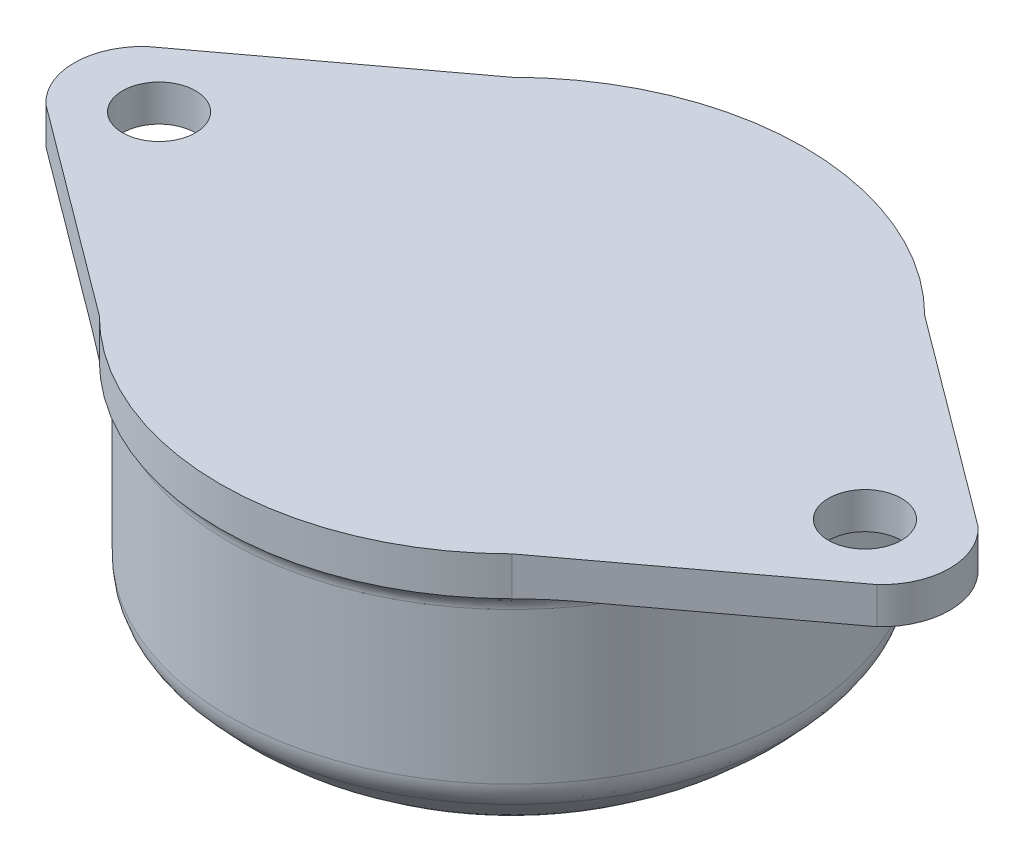
ISO-10303-21;
HEADER;
FILE_DESCRIPTION(('STEP AP214'),'2;1');
FILE_NAME('part.step','',(''),(''),'','','');
FILE_SCHEMA(('AUTOMOTIVE_DESIGN { 1 0 10303 214 1 1 1 1 }'));
ENDSEC;
DATA;
#1=APPLICATION_CONTEXT('core data for automotive mechanical design processes');
#2=APPLICATION_PROTOCOL_DEFINITION('international standard','automotive_design',2000,#1);
#3=PRODUCT_CONTEXT('',#1,'mechanical');
#4=PRODUCT('Part','Part','',(#3));
#5=PRODUCT_RELATED_PRODUCT_CATEGORY('part','',(#4));
#6=PRODUCT_DEFINITION_FORMATION('','',#4);
#7=PRODUCT_DEFINITION_CONTEXT('part definition',#1,'design');
#8=PRODUCT_DEFINITION('design','',#6,#7);
#9=PRODUCT_DEFINITION_SHAPE('','',#8);
#10=(LENGTH_UNIT() NAMED_UNIT(*) SI_UNIT(.MILLI.,.METRE.));
#11=(NAMED_UNIT(*) PLANE_ANGLE_UNIT() SI_UNIT($,.RADIAN.));
#12=(NAMED_UNIT(*) SI_UNIT($,.STERADIAN.) SOLID_ANGLE_UNIT());
#13=UNCERTAINTY_MEASURE_WITH_UNIT(LENGTH_MEASURE(1.E-05),#10,'distance_accuracy_value','');
#14=(GEOMETRIC_REPRESENTATION_CONTEXT(3) GLOBAL_UNCERTAINTY_ASSIGNED_CONTEXT((#13)) GLOBAL_UNIT_ASSIGNED_CONTEXT((#10,
#11,#12)) REPRESENTATION_CONTEXT('',''));
#15=CARTESIAN_POINT('',(0.,0.,0.));
#16=DIRECTION('',(0.,0.,1.));
#17=DIRECTION('',(1.,0.,0.));
#18=AXIS2_PLACEMENT_3D('',#15,#16,#17);
#19=CARTESIAN_POINT('',(0.,0.,0.));
#20=DIRECTION('',(0.,1.,0.));
#21=DIRECTION('',(0.,0.,1.));
#22=AXIS2_PLACEMENT_3D('',#19,#20,#21);
#23=PLANE('',#22);
#24=CARTESIAN_POINT('',(19.35,0.,0.));
#25=DIRECTION('',(0.,1.,0.));
#26=DIRECTION('',(0.,0.,1.));
#27=AXIS2_PLACEMENT_3D('',#24,#25,#26);
#28=CIRCLE('',#27,2.00000000000001);
#29=CARTESIAN_POINT('',(19.35,0.,2.00000000000004));
#30=VERTEX_POINT('',#29);
#31=EDGE_CURVE('E290',#30,#30,#28,.T.);
#32=ORIENTED_EDGE('',*,*,#31,.T.);
#33=EDGE_LOOP('',(#32));
#34=FACE_BOUND('',#33,.T.);
#35=DIRECTION('',(0.801828374036416,0.,-0.597554398017551));
#36=VECTOR('',#35,1.);
#37=CARTESIAN_POINT('',(11.3137084989848,0.,11.3137084989847));
#38=LINE('',#37,#36);
#39=CARTESIAN_POINT('',(13.1864053543579,0.,9.91810031359637));
#40=VERTEX_POINT('',#39);
#41=CARTESIAN_POINT('',(22.7763453443649,0.,2.77129558167407));
#42=VERTEX_POINT('',#41);
#43=EDGE_CURVE('E271',#40,#42,#38,.T.);
#44=ORIENTED_EDGE('',*,*,#43,.F.);
#45=CARTESIAN_POINT('',(0.,0.,0.));
#46=DIRECTION('',(0.,1.,0.));
#47=DIRECTION('',(0.,0.,1.));
#48=AXIS2_PLACEMENT_3D('',#45,#46,#47);
#49=CIRCLE('',#48,16.5);
#50=CARTESIAN_POINT('',(13.186405354358,0.,-9.91810031359635));
#51=VERTEX_POINT('',#50);
#52=EDGE_CURVE('E151',#40,#51,#49,.T.);
#53=ORIENTED_EDGE('',*,*,#52,.T.);
#54=DIRECTION('',(-0.801828374036412,0.,-0.597554398017557));
#55=VECTOR('',#54,1.);
#56=CARTESIAN_POINT('',(11.3137084989847,0.,-11.3137084989848));
#57=LINE('',#56,#55);
#58=CARTESIAN_POINT('',(22.7763453443649,0.,-2.7712955816739));
#59=VERTEX_POINT('',#58);
#60=EDGE_CURVE('E264',#59,#51,#57,.T.);
#61=ORIENTED_EDGE('',*,*,#60,.F.);
#62=CARTESIAN_POINT('',(20.2500000000001,0.,1.05384451165591E-13));
#63=DIRECTION('',(0.,1.,0.));
#64=DIRECTION('',(0.,0.,1.));
#65=AXIS2_PLACEMENT_3D('',#62,#63,#64);
#66=CIRCLE('',#65,3.74999999999992);
#67=EDGE_CURVE('E268',#42,#59,#66,.T.);
#68=ORIENTED_EDGE('',*,*,#67,.F.);
#69=EDGE_LOOP('',(#44,#53,#61,#68));
#70=FACE_BOUND('',#69,.T.);
#71=ADVANCED_FACE('F41',(#34,#70),#23,.F.);
#72=CARTESIAN_POINT('',(0.,2.,0.));
#73=DIRECTION('',(0.,1.,0.));
#74=DIRECTION('',(0.,0.,1.));
#75=AXIS2_PLACEMENT_3D('',#72,#73,#74);
#76=PLANE('',#75);
#77=CARTESIAN_POINT('',(-19.35,2.,0.));
#78=DIRECTION('',(0.,1.,0.));
#79=DIRECTION('',(0.,0.,1.));
#80=AXIS2_PLACEMENT_3D('',#77,#78,#79);
#81=CIRCLE('',#80,2.);
#82=CARTESIAN_POINT('',(-19.35,2.,2.00000000000002));
#83=VERTEX_POINT('',#82);
#84=EDGE_CURVE('E275',#83,#83,#81,.T.);
#85=ORIENTED_EDGE('',*,*,#84,.F.);
#86=EDGE_LOOP('',(#85));
#87=FACE_BOUND('',#86,.T.);
#88=CARTESIAN_POINT('',(0.,2.,0.));
#89=DIRECTION('',(0.,1.,0.));
#90=DIRECTION('',(0.,0.,1.));
#91=AXIS2_PLACEMENT_3D('',#88,#89,#90);
#92=CIRCLE('',#91,16.);
#93=CARTESIAN_POINT('',(-11.3137084989847,2.,11.3137084989848));
#94=VERTEX_POINT('',#93);
#95=CARTESIAN_POINT('',(11.3137084989848,2.,11.3137084989847));
#96=VERTEX_POINT('',#95);
#97=EDGE_CURVE('E130',#94,#96,#92,.T.);
#98=ORIENTED_EDGE('',*,*,#97,.T.);
#99=DIRECTION('',(0.801828374036416,0.,-0.597554398017551));
#100=VECTOR('',#99,1.);
#101=CARTESIAN_POINT('',(11.3137084989848,2.,11.3137084989847));
#102=LINE('',#101,#100);
#103=CARTESIAN_POINT('',(22.7763453443649,2.,2.77129558167407));
#104=VERTEX_POINT('',#103);
#105=EDGE_CURVE('E122',#96,#104,#102,.T.);
#106=ORIENTED_EDGE('',*,*,#105,.T.);
#107=CARTESIAN_POINT('',(20.2500000000001,2.,1.05384451165591E-13));
#108=DIRECTION('',(0.,1.,0.));
#109=DIRECTION('',(0.,0.,1.));
#110=AXIS2_PLACEMENT_3D('',#107,#108,#109);
#111=CIRCLE('',#110,3.74999999999992);
#112=CARTESIAN_POINT('',(22.7763453443649,2.,-2.7712955816739));
#113=VERTEX_POINT('',#112);
#114=EDGE_CURVE('E129',#104,#113,#111,.T.);
#115=ORIENTED_EDGE('',*,*,#114,.T.);
#116=DIRECTION('',(-0.801828374036412,0.,-0.597554398017557));
#117=VECTOR('',#116,1.);
#118=CARTESIAN_POINT('',(11.3137084989847,2.,-11.3137084989848));
#119=LINE('',#118,#117);
#120=CARTESIAN_POINT('',(11.3137084989847,2.,-11.3137084989848));
#121=VERTEX_POINT('',#120);
#122=EDGE_CURVE('E265',#113,#121,#119,.T.);
#123=ORIENTED_EDGE('',*,*,#122,.T.);
#124=CARTESIAN_POINT('',(0.,2.,0.));
#125=DIRECTION('',(0.,1.,0.));
#126=DIRECTION('',(0.,0.,1.));
#127=AXIS2_PLACEMENT_3D('',#124,#125,#126);
#128=CIRCLE('',#127,16.);
#129=CARTESIAN_POINT('',(-11.3137084989848,2.,-11.3137084989847));
#130=VERTEX_POINT('',#129);
#131=EDGE_CURVE('E280',#121,#130,#128,.T.);
#132=ORIENTED_EDGE('',*,*,#131,.T.);
#133=DIRECTION('',(-0.801828374036416,0.,0.59755439801755));
#134=VECTOR('',#133,1.);
#135=CARTESIAN_POINT('',(-22.7763453443647,2.,-2.77129558167421));
#136=LINE('',#135,#134);
#137=CARTESIAN_POINT('',(-22.7763453443647,2.,-2.77129558167421));
#138=VERTEX_POINT('',#137);
#139=EDGE_CURVE('E231',#130,#138,#136,.T.);
#140=ORIENTED_EDGE('',*,*,#139,.T.);
#141=CARTESIAN_POINT('',(-20.25,2.,0.));
#142=DIRECTION('',(0.,1.,0.));
#143=DIRECTION('',(0.,0.,1.));
#144=AXIS2_PLACEMENT_3D('',#141,#142,#143);
#145=CIRCLE('',#144,3.75000000000001);
#146=CARTESIAN_POINT('',(-22.7763453443649,2.,2.77129558167396));
#147=VERTEX_POINT('',#146);
#148=EDGE_CURVE('E277',#138,#147,#145,.T.);
#149=ORIENTED_EDGE('',*,*,#148,.T.);
#150=DIRECTION('',(0.801828374036411,0.,0.597554398017557));
#151=VECTOR('',#150,1.);
#152=CARTESIAN_POINT('',(-11.3137084989847,2.,11.3137084989848));
#153=LINE('',#152,#151);
#154=EDGE_CURVE('E135',#147,#94,#153,.T.);
#155=ORIENTED_EDGE('',*,*,#154,.T.);
#156=EDGE_LOOP('',(#98,#106,#115,#123,#132,#140,#149,#155));
#157=FACE_BOUND('',#156,.T.);
#158=CARTESIAN_POINT('',(19.35,2.,0.));
#159=DIRECTION('',(0.,1.,0.));
#160=DIRECTION('',(0.,0.,1.));
#161=AXIS2_PLACEMENT_3D('',#158,#159,#160);
#162=CIRCLE('',#161,2.00000000000001);
#163=CARTESIAN_POINT('',(19.35,2.,2.00000000000004));
#164=VERTEX_POINT('',#163);
#165=EDGE_CURVE('E287',#164,#164,#162,.T.);
#166=ORIENTED_EDGE('',*,*,#165,.F.);
#167=EDGE_LOOP('',(#166));
#168=FACE_BOUND('',#167,.T.);
#169=ADVANCED_FACE('F132',(#87,#157,#168),#76,.T.);
#170=DIRECTION('',(-0.801828374036416,0.,0.59755439801755));
#171=VECTOR('',#170,1.);
#172=CARTESIAN_POINT('',(-22.7763453443647,0.,-2.77129558167421));
#173=LINE('',#172,#171);
#174=CARTESIAN_POINT('',(-13.1864053543579,0.,-9.91810031359639));
#175=VERTEX_POINT('',#174);
#176=CARTESIAN_POINT('',(-22.7763453443647,0.,-2.77129558167421));
#177=VERTEX_POINT('',#176);
#178=EDGE_CURVE('E246',#175,#177,#173,.T.);
#179=ORIENTED_EDGE('',*,*,#178,.F.);
#180=CARTESIAN_POINT('',(0.,0.,0.));
#181=DIRECTION('',(0.,1.,0.));
#182=DIRECTION('',(0.,0.,1.));
#183=AXIS2_PLACEMENT_3D('',#180,#181,#182);
#184=CIRCLE('',#183,16.5);
#185=CARTESIAN_POINT('',(-13.1864053543579,0.,9.91810031359638));
#186=VERTEX_POINT('',#185);
#187=EDGE_CURVE('E144',#175,#186,#184,.T.);
#188=ORIENTED_EDGE('',*,*,#187,.T.);
#189=DIRECTION('',(0.801828374036411,0.,0.597554398017557));
#190=VECTOR('',#189,1.);
#191=CARTESIAN_POINT('',(-11.3137084989847,0.,11.3137084989848));
#192=LINE('',#191,#190);
#193=CARTESIAN_POINT('',(-22.7763453443649,0.,2.77129558167396));
#194=VERTEX_POINT('',#193);
#195=EDGE_CURVE('E136',#194,#186,#192,.T.);
#196=ORIENTED_EDGE('',*,*,#195,.F.);
#197=CARTESIAN_POINT('',(-20.25,0.,0.));
#198=DIRECTION('',(0.,1.,0.));
#199=DIRECTION('',(0.,0.,1.));
#200=AXIS2_PLACEMENT_3D('',#197,#198,#199);
#201=CIRCLE('',#200,3.75000000000001);
#202=EDGE_CURVE('E250',#177,#194,#201,.T.);
#203=ORIENTED_EDGE('',*,*,#202,.F.);
#204=EDGE_LOOP('',(#179,#188,#196,#203));
#205=FACE_BOUND('',#204,.T.);
#206=CARTESIAN_POINT('',(-19.35,0.,0.));
#207=DIRECTION('',(0.,1.,0.));
#208=DIRECTION('',(0.,0.,1.));
#209=AXIS2_PLACEMENT_3D('',#206,#207,#208);
#210=CIRCLE('',#209,2.);
#211=CARTESIAN_POINT('',(-19.35,0.,2.00000000000002));
#212=VERTEX_POINT('',#211);
#213=EDGE_CURVE('E284',#212,#212,#210,.T.);
#214=ORIENTED_EDGE('',*,*,#213,.T.);
#215=EDGE_LOOP('',(#214));
#216=FACE_BOUND('',#215,.T.);
#217=ADVANCED_FACE('F178',(#205,#216),#23,.F.);
#218=CARTESIAN_POINT('',(0.,2.,0.));
#219=DIRECTION('',(0.,-1.,0.));
#220=DIRECTION('',(0.,0.,-1.));
#221=AXIS2_PLACEMENT_3D('',#218,#219,#220);
#222=CYLINDRICAL_SURFACE('',#221,16.);
#223=DIRECTION('',(0.,-1.,0.));
#224=VECTOR('',#223,1.);
#225=CARTESIAN_POINT('',(-11.3137084989847,2.,11.3137084989848));
#226=LINE('',#225,#224);
#227=CARTESIAN_POINT('',(-11.3137084989847,-0.133974596215559,11.3137084989848));
#228=VERTEX_POINT('',#227);
#229=EDGE_CURVE('E68',#94,#228,#226,.T.);
#230=ORIENTED_EDGE('',*,*,#229,.T.);
#231=CARTESIAN_POINT('',(0.,-0.133974596215559,0.));
#232=DIRECTION('',(0.,1.,0.));
#233=DIRECTION('',(0.,0.,1.));
#234=AXIS2_PLACEMENT_3D('',#231,#232,#233);
#235=CIRCLE('',#234,16.);
#236=CARTESIAN_POINT('',(11.3137084989848,-0.133974596215568,11.3137084989847));
#237=VERTEX_POINT('',#236);
#238=EDGE_CURVE('E55',#228,#237,#235,.T.);
#239=ORIENTED_EDGE('',*,*,#238,.T.);
#240=DIRECTION('',(0.,-1.,0.));
#241=VECTOR('',#240,1.);
#242=CARTESIAN_POINT('',(11.3137084989848,2.,11.3137084989847));
#243=LINE('',#242,#241);
#244=EDGE_CURVE('E61',#96,#237,#243,.T.);
#245=ORIENTED_EDGE('',*,*,#244,.F.);
#246=ORIENTED_EDGE('',*,*,#97,.F.);
#247=EDGE_LOOP('',(#230,#239,#245,#246));
#248=FACE_BOUND('',#247,.T.);
#249=ADVANCED_FACE('F138',(#248),#222,.T.);
#250=CARTESIAN_POINT('',(11.3137084989848,2.,11.3137084989847));
#251=DIRECTION('',(-0.597554398017551,0.,-0.801828374036416));
#252=DIRECTION('',(-0.801828374036416,0.,0.597554398017551));
#253=AXIS2_PLACEMENT_3D('',#250,#251,#252);
#254=PLANE('',#253);
#255=ORIENTED_EDGE('',*,*,#244,.T.);
#256=CARTESIAN_POINT('',(11.3137084989848,-0.133974596215568,11.3137084989847));
#257=CARTESIAN_POINT('',(11.446969718458,-0.120115456801657,11.2143969376084));
#258=CARTESIAN_POINT('',(11.5802287100413,-0.106122846203122,11.1150870365443));
#259=CARTESIAN_POINT('',(11.8468763431593,-0.0791977185284216,10.9163706141152));
#260=CARTESIAN_POINT('',(11.9802650161484,-0.0662656941317097,10.8169640693092));
#261=CARTESIAN_POINT('',(12.2470084722754,-0.042819396008579,10.6181762357623));
#262=CARTESIAN_POINT('',(12.3803630712968,-0.0323019802157537,10.5187950842324));
#263=CARTESIAN_POINT('',(12.6472144839868,-0.0150562832358394,10.3199267971608));
#264=CARTESIAN_POINT('',(12.7807112616607,-0.00832720205072006,10.2204396884437));
#265=CARTESIAN_POINT('',(12.9596037647791,-0.0028968892817603,10.0871218794559));
#266=CARTESIAN_POINT('',(13.0049542798936,-0.00182886067470516,10.0533248717214));
#267=CARTESIAN_POINT('',(13.0956712958071,-0.000380576470654455,9.98571894308448));
#268=CARTESIAN_POINT('',(13.1410377979908,-4.58005487320585E-07,9.95191002115015));
#269=CARTESIAN_POINT('',(13.1864053543579,0.,9.91810031359636));
#270=B_SPLINE_CURVE_WITH_KNOTS('',3,(#256,#257,#258,#259,#260,#261,#262,#263,#264,#265,#266,
#267,#268,#269),.UNSPECIFIED.,.F.,.F.,(4,2,2,2,2,2,4),(0.,0.500335344362866,1.00090181083163,
1.50081316397541,2.00061890916819,2.17032211674865,2.34005915018422),.UNSPECIFIED.);
#271=EDGE_CURVE('E11',#237,#40,#270,.T.);
#272=ORIENTED_EDGE('',*,*,#271,.T.);
#273=ORIENTED_EDGE('',*,*,#43,.T.);
#274=DIRECTION('',(0.,-1.,0.));
#275=VECTOR('',#274,1.);
#276=CARTESIAN_POINT('',(22.7763453443649,2.,2.77129558167407));
#277=LINE('',#276,#275);
#278=EDGE_CURVE('E126',#104,#42,#277,.T.);
#279=ORIENTED_EDGE('',*,*,#278,.F.);
#280=ORIENTED_EDGE('',*,*,#105,.F.);
#281=EDGE_LOOP('',(#255,#272,#273,#279,#280));
#282=FACE_BOUND('',#281,.T.);
#283=ADVANCED_FACE('F124',(#282),#254,.F.);
#284=CARTESIAN_POINT('',(20.2500000000001,2.,1.05384451165591E-13));
#285=DIRECTION('',(0.,-1.,0.));
#286=DIRECTION('',(0.,0.,-1.));
#287=AXIS2_PLACEMENT_3D('',#284,#285,#286);
#288=CYLINDRICAL_SURFACE('',#287,3.74999999999992);
#289=ORIENTED_EDGE('',*,*,#67,.T.);
#290=DIRECTION('',(0.,-1.,0.));
#291=VECTOR('',#290,1.);
#292=CARTESIAN_POINT('',(22.7763453443649,2.,-2.7712955816739));
#293=LINE('',#292,#291);
#294=EDGE_CURVE('E146',#113,#59,#293,.T.);
#295=ORIENTED_EDGE('',*,*,#294,.F.);
#296=ORIENTED_EDGE('',*,*,#114,.F.);
#297=ORIENTED_EDGE('',*,*,#278,.T.);
#298=EDGE_LOOP('',(#289,#295,#296,#297));
#299=FACE_BOUND('',#298,.T.);
#300=ADVANCED_FACE('F170',(#299),#288,.T.);
#301=CARTESIAN_POINT('',(11.3137084989847,2.,-11.3137084989848));
#302=DIRECTION('',(-0.597554398017557,0.,0.801828374036412));
#303=DIRECTION('',(0.801828374036412,0.,0.597554398017557));
#304=AXIS2_PLACEMENT_3D('',#301,#302,#303);
#305=PLANE('',#304);
#306=ORIENTED_EDGE('',*,*,#60,.T.);
#307=CARTESIAN_POINT('',(13.186405354358,0.,-9.91810031359635));
#308=CARTESIAN_POINT('',(13.052448437366,-4.82983793586511E-05,-10.0179303364359));
#309=CARTESIAN_POINT('',(12.9185344029504,-0.00331494670854548,-10.1177284014738));
#310=CARTESIAN_POINT('',(12.650891687522,-0.0147276215200928,-10.3171863988211));
#311=CARTESIAN_POINT('',(12.5171629515532,-0.0228715482364769,-10.416846372086));
#312=CARTESIAN_POINT('',(12.2499286173541,-0.0424802476792142,-10.6160000274974));
#313=CARTESIAN_POINT('',(12.1164229512043,-0.0539436890167166,-10.7154937602603));
#314=CARTESIAN_POINT('',(11.8495204014616,-0.078838327160745,-10.9144001566977));
#315=CARTESIAN_POINT('',(11.7161235286037,-0.0922696989465195,-11.0138128123721));
#316=CARTESIAN_POINT('',(11.5379074851518,-0.110638546506816,-11.1466264967094));
#317=CARTESIAN_POINT('',(11.4930688451498,-0.115296032255935,-11.1800420347496));
#318=CARTESIAN_POINT('',(11.4033899992735,-0.124632156516627,-11.2468742777803));
#319=CARTESIAN_POINT('',(11.3585497934911,-0.129310796403644,-11.2802909827023));
#320=CARTESIAN_POINT('',(11.3137084989847,-0.133974596215567,-11.3137084989848));
#321=B_SPLINE_CURVE_WITH_KNOTS('',3,(#307,#308,#309,#310,#311,#312,#313,#314,#315,#316,#317,
#318,#319,#320),.UNSPECIFIED.,.F.,.F.,(4,2,2,2,2,2,4),(0.,0.501087578151189,1.00195958299378,
1.50263097599357,2.00334691341778,2.17168938449952,2.34004296331917),.UNSPECIFIED.);
#322=CARTESIAN_POINT('',(11.3137084989847,-0.133974596215568,-11.3137084989848));
#323=VERTEX_POINT('',#322);
#324=EDGE_CURVE('E154',#51,#323,#321,.T.);
#325=ORIENTED_EDGE('',*,*,#324,.T.);
#326=DIRECTION('',(0.,-1.,0.));
#327=VECTOR('',#326,1.);
#328=CARTESIAN_POINT('',(11.3137084989847,2.,-11.3137084989848));
#329=LINE('',#328,#327);
#330=EDGE_CURVE('E233',#121,#323,#329,.T.);
#331=ORIENTED_EDGE('',*,*,#330,.F.);
#332=ORIENTED_EDGE('',*,*,#122,.F.);
#333=ORIENTED_EDGE('',*,*,#294,.T.);
#334=EDGE_LOOP('',(#306,#325,#331,#332,#333));
#335=FACE_BOUND('',#334,.T.);
#336=ADVANCED_FACE('F164',(#335),#305,.F.);
#337=CARTESIAN_POINT('',(0.,2.,0.));
#338=DIRECTION('',(0.,-1.,0.));
#339=DIRECTION('',(0.,0.,-1.));
#340=AXIS2_PLACEMENT_3D('',#337,#338,#339);
#341=CYLINDRICAL_SURFACE('',#340,16.);
#342=ORIENTED_EDGE('',*,*,#330,.T.);
#343=CARTESIAN_POINT('',(0.,-0.133974596215568,0.));
#344=DIRECTION('',(0.,1.,0.));
#345=DIRECTION('',(0.,0.,1.));
#346=AXIS2_PLACEMENT_3D('',#343,#344,#345);
#347=CIRCLE('',#346,16.);
#348=CARTESIAN_POINT('',(-11.3137084989848,-0.13397459621556,-11.3137084989847));
#349=VERTEX_POINT('',#348);
#350=EDGE_CURVE('E162',#323,#349,#347,.T.);
#351=ORIENTED_EDGE('',*,*,#350,.T.);
#352=DIRECTION('',(0.,-1.,0.));
#353=VECTOR('',#352,1.);
#354=CARTESIAN_POINT('',(-11.3137084989848,2.,-11.3137084989847));
#355=LINE('',#354,#353);
#356=EDGE_CURVE('E226',#130,#349,#355,.T.);
#357=ORIENTED_EDGE('',*,*,#356,.F.);
#358=ORIENTED_EDGE('',*,*,#131,.F.);
#359=EDGE_LOOP('',(#342,#351,#357,#358));
#360=FACE_BOUND('',#359,.T.);
#361=ADVANCED_FACE('F169',(#360),#341,.T.);
#362=CARTESIAN_POINT('',(-22.7763453443647,2.,-2.77129558167421));
#363=DIRECTION('',(0.59755439801755,0.,0.801828374036416));
#364=DIRECTION('',(0.801828374036416,0.,-0.597554398017551));
#365=AXIS2_PLACEMENT_3D('',#362,#363,#364);
#366=PLANE('',#365);
#367=ORIENTED_EDGE('',*,*,#356,.T.);
#368=CARTESIAN_POINT('',(-11.3137084989848,-0.13397459621556,-11.3137084989847));
#369=CARTESIAN_POINT('',(-11.446969718458,-0.120115456801652,-11.2143969376084));
#370=CARTESIAN_POINT('',(-11.5802287100413,-0.106122846203118,-11.1150870365443));
#371=CARTESIAN_POINT('',(-11.8468763431593,-0.0791977185284186,-10.9163706141152));
#372=CARTESIAN_POINT('',(-11.9802650161484,-0.0662656941317064,-10.8169640693092));
#373=CARTESIAN_POINT('',(-12.2470084722754,-0.0428193960085759,-10.6181762357623));
#374=CARTESIAN_POINT('',(-12.3803630712968,-0.0323019802157509,-10.5187950842324));
#375=CARTESIAN_POINT('',(-12.6472144839868,-0.0150562832358374,-10.3199267971608));
#376=CARTESIAN_POINT('',(-12.7807112616607,-0.00832720205071841,-10.2204396884437));
#377=CARTESIAN_POINT('',(-12.9596037647791,-0.00289688928175975,-10.0871218794559));
#378=CARTESIAN_POINT('',(-13.0049542798936,-0.00182886067470498,-10.0533248717214));
#379=CARTESIAN_POINT('',(-13.0956712958071,-0.000380576470654668,-9.98571894308449));
#380=CARTESIAN_POINT('',(-13.1410377979908,-4.58005487574667E-07,-9.95191002115018));
#381=CARTESIAN_POINT('',(-13.1864053543579,0.,-9.91810031359639));
#382=B_SPLINE_CURVE_WITH_KNOTS('',3,(#368,#369,#370,#371,#372,#373,#374,#375,#376,#377,#378,
#379,#380,#381),.UNSPECIFIED.,.F.,.F.,(4,2,2,2,2,2,4),(0.,0.500335344362864,1.00090181083163,
1.50081316397541,2.00061890916819,2.17032211674863,2.34005915018418),.UNSPECIFIED.);
#383=EDGE_CURVE('E209',#349,#175,#382,.T.);
#384=ORIENTED_EDGE('',*,*,#383,.T.);
#385=ORIENTED_EDGE('',*,*,#178,.T.);
#386=DIRECTION('',(0.,-1.,0.));
#387=VECTOR('',#386,1.);
#388=CARTESIAN_POINT('',(-22.7763453443647,2.,-2.77129558167421));
#389=LINE('',#388,#387);
#390=EDGE_CURVE('E234',#138,#177,#389,.T.);
#391=ORIENTED_EDGE('',*,*,#390,.F.);
#392=ORIENTED_EDGE('',*,*,#139,.F.);
#393=EDGE_LOOP('',(#367,#384,#385,#391,#392));
#394=FACE_BOUND('',#393,.T.);
#395=ADVANCED_FACE('F214',(#394),#366,.F.);
#396=CARTESIAN_POINT('',(-20.25,2.,0.));
#397=DIRECTION('',(0.,-1.,0.));
#398=DIRECTION('',(0.,0.,-1.));
#399=AXIS2_PLACEMENT_3D('',#396,#397,#398);
#400=CYLINDRICAL_SURFACE('',#399,3.75000000000001);
#401=ORIENTED_EDGE('',*,*,#202,.T.);
#402=DIRECTION('',(0.,-1.,0.));
#403=VECTOR('',#402,1.);
#404=CARTESIAN_POINT('',(-22.7763453443649,2.,2.77129558167396));
#405=LINE('',#404,#403);
#406=EDGE_CURVE('E249',#147,#194,#405,.T.);
#407=ORIENTED_EDGE('',*,*,#406,.F.);
#408=ORIENTED_EDGE('',*,*,#148,.F.);
#409=ORIENTED_EDGE('',*,*,#390,.T.);
#410=EDGE_LOOP('',(#401,#407,#408,#409));
#411=FACE_BOUND('',#410,.T.);
#412=ADVANCED_FACE('F201',(#411),#400,.T.);
#413=CARTESIAN_POINT('',(-11.3137084989847,2.,11.3137084989848));
#414=DIRECTION('',(0.597554398017557,0.,-0.801828374036411));
#415=DIRECTION('',(-0.801828374036411,0.,-0.597554398017557));
#416=AXIS2_PLACEMENT_3D('',#413,#414,#415);
#417=PLANE('',#416);
#418=ORIENTED_EDGE('',*,*,#195,.T.);
#419=CARTESIAN_POINT('',(-13.1864053543579,0.,9.91810031359638));
#420=CARTESIAN_POINT('',(-13.052448437366,-4.82983793589801E-05,10.0179303364359));
#421=CARTESIAN_POINT('',(-12.9185344029503,-0.00331494670854557,10.1177284014738));
#422=CARTESIAN_POINT('',(-12.650891687522,-0.0147276215200923,10.3171863988212));
#423=CARTESIAN_POINT('',(-12.5171629515531,-0.022871548236476,10.416846372086));
#424=CARTESIAN_POINT('',(-12.2499286173541,-0.0424802476792134,10.6160000274975));
#425=CARTESIAN_POINT('',(-12.1164229512043,-0.0539436890167162,10.7154937602603));
#426=CARTESIAN_POINT('',(-11.8495204014616,-0.0788383271607444,10.9144001566978));
#427=CARTESIAN_POINT('',(-11.7161235286037,-0.0922696989465183,11.0138128123721));
#428=CARTESIAN_POINT('',(-11.5379074851518,-0.110638546506813,11.1466264967095));
#429=CARTESIAN_POINT('',(-11.4930688451498,-0.11529603225593,11.1800420347496));
#430=CARTESIAN_POINT('',(-11.4033899992735,-0.12463215651662,11.2468742777803));
#431=CARTESIAN_POINT('',(-11.3585497934911,-0.129310796403637,11.2802909827023));
#432=CARTESIAN_POINT('',(-11.3137084989847,-0.13397459621556,11.3137084989848));
#433=B_SPLINE_CURVE_WITH_KNOTS('',3,(#419,#420,#421,#422,#423,#424,#425,#426,#427,#428,#429,
#430,#431,#432),.UNSPECIFIED.,.F.,.F.,(4,2,2,2,2,2,4),(0.,0.501087578151188,1.00195958299378,
1.50263097599357,2.00334691341778,2.1716893844995,2.34004296331911),.UNSPECIFIED.);
#434=EDGE_CURVE('E204',#186,#228,#433,.T.);
#435=ORIENTED_EDGE('',*,*,#434,.T.);
#436=ORIENTED_EDGE('',*,*,#229,.F.);
#437=ORIENTED_EDGE('',*,*,#154,.F.);
#438=ORIENTED_EDGE('',*,*,#406,.T.);
#439=EDGE_LOOP('',(#418,#435,#436,#437,#438));
#440=FACE_BOUND('',#439,.T.);
#441=ADVANCED_FACE('F196',(#440),#417,.F.);
#442=CARTESIAN_POINT('',(-19.35,2.,0.));
#443=DIRECTION('',(0.,-1.,0.));
#444=DIRECTION('',(0.,0.,-1.));
#445=AXIS2_PLACEMENT_3D('',#442,#443,#444);
#446=CYLINDRICAL_SURFACE('',#445,2.);
#447=ORIENTED_EDGE('',*,*,#84,.T.);
#448=EDGE_LOOP('',(#447));
#449=FACE_BOUND('',#448,.T.);
#450=ORIENTED_EDGE('',*,*,#213,.F.);
#451=EDGE_LOOP('',(#450));
#452=FACE_BOUND('',#451,.T.);
#453=ADVANCED_FACE('F200',(#449,#452),#446,.F.);
#454=CARTESIAN_POINT('',(19.35,2.,0.));
#455=DIRECTION('',(0.,-1.,0.));
#456=DIRECTION('',(0.,0.,-1.));
#457=AXIS2_PLACEMENT_3D('',#454,#455,#456);
#458=CYLINDRICAL_SURFACE('',#457,2.00000000000001);
#459=ORIENTED_EDGE('',*,*,#165,.T.);
#460=EDGE_LOOP('',(#459));
#461=FACE_BOUND('',#460,.T.);
#462=ORIENTED_EDGE('',*,*,#31,.F.);
#463=EDGE_LOOP('',(#462));
#464=FACE_BOUND('',#463,.T.);
#465=ADVANCED_FACE('F325',(#461,#464),#458,.F.);
#466=CARTESIAN_POINT('',(0.,-1.49427955390235,0.));
#467=DIRECTION('',(0.,-1.,0.));
#468=DIRECTION('',(0.,0.,-1.));
#469=AXIS2_PLACEMENT_3D('',#466,#467,#468);
#470=DEGENERATE_TOROIDAL_SURFACE('',#469,4.38007555363633,14.,.T.);
#471=CARTESIAN_POINT('',(0.,-15.4125,0.));
#472=DIRECTION('',(0.,-1.,0.));
#473=DIRECTION('',(0.,0.,-1.));
#474=AXIS2_PLACEMENT_3D('',#471,#472,#473);
#475=CIRCLE('',#474,5.89108171306424);
#476=CARTESIAN_POINT('',(0.,-15.4125,-5.89108171306425));
#477=VERTEX_POINT('',#476);
#478=EDGE_CURVE('E292',#477,#477,#475,.T.);
#479=ORIENTED_EDGE('',*,*,#478,.F.);
#480=EDGE_LOOP('',(#479));
#481=FACE_BOUND('',#480,.T.);
#482=CARTESIAN_POINT('',(0.,-10.5933056411919,0.));
#483=DIRECTION('',(0.,-1.,0.));
#484=DIRECTION('',(0.,0.,-1.));
#485=AXIS2_PLACEMENT_3D('',#482,#483,#484);
#486=CIRCLE('',#485,15.0199874077273);
#487=CARTESIAN_POINT('',(0.,-10.5933056411918,-15.0199874077273));
#488=VERTEX_POINT('',#487);
#489=EDGE_CURVE('E300',#488,#488,#486,.T.);
#490=ORIENTED_EDGE('',*,*,#489,.T.);
#491=EDGE_LOOP('',(#490));
#492=FACE_BOUND('',#491,.T.);
#493=ADVANCED_FACE('F304',(#481,#492),#470,.T.);
#494=CARTESIAN_POINT('',(0.,-10.,0.));
#495=DIRECTION('',(0.,-1.,0.));
#496=DIRECTION('',(0.,0.,1.));
#497=AXIS2_PLACEMENT_3D('',#494,#495,#496);
#498=SPHERICAL_SURFACE('',#497,8.);
#499=ORIENTED_EDGE('',*,*,#478,.T.);
#500=EDGE_LOOP('',(#499));
#501=FACE_BOUND('',#500,.T.);
#502=ADVANCED_FACE('F313',(#501),#498,.T.);
#503=CARTESIAN_POINT('',(0.,-18.,0.));
#504=DIRECTION('',(0.,-1.,0.));
#505=DIRECTION('',(0.,0.,-1.));
#506=AXIS2_PLACEMENT_3D('',#503,#504,#505);
#507=CYLINDRICAL_SURFACE('',#506,15.5);
#508=CARTESIAN_POINT('',(0.,-1.,0.));
#509=DIRECTION('',(0.,1.,0.));
#510=DIRECTION('',(0.,0.,1.));
#511=AXIS2_PLACEMENT_3D('',#508,#509,#510);
#512=CIRCLE('',#511,15.5);
#513=CARTESIAN_POINT('',(0.,-1.,15.5));
#514=VERTEX_POINT('',#513);
#515=EDGE_CURVE('E141',#514,#514,#512,.F.);
#516=ORIENTED_EDGE('',*,*,#515,.T.);
#517=EDGE_LOOP('',(#516));
#518=FACE_BOUND('',#517,.T.);
#519=CARTESIAN_POINT('',(0.,-9.29344477157906,0.));
#520=DIRECTION('',(0.,-1.,0.));
#521=DIRECTION('',(0.,0.,-1.));
#522=AXIS2_PLACEMENT_3D('',#519,#520,#521);
#523=CIRCLE('',#522,15.5);
#524=CARTESIAN_POINT('',(0.,-9.29344477157906,-15.5));
#525=VERTEX_POINT('',#524);
#526=EDGE_CURVE('E297',#525,#525,#523,.T.);
#527=ORIENTED_EDGE('',*,*,#526,.F.);
#528=EDGE_LOOP('',(#527));
#529=FACE_BOUND('',#528,.T.);
#530=ADVANCED_FACE('F308',(#518,#529),#507,.T.);
#531=CARTESIAN_POINT('',(0.,-9.29344477157906,0.));
#532=DIRECTION('',(0.,-1.,0.));
#533=DIRECTION('',(0.,0.,-1.));
#534=AXIS2_PLACEMENT_3D('',#531,#532,#533);
#535=TOROIDAL_SURFACE('',#534,13.5,2.);
#536=ORIENTED_EDGE('',*,*,#489,.F.);
#537=EDGE_LOOP('',(#536));
#538=FACE_BOUND('',#537,.T.);
#539=ORIENTED_EDGE('',*,*,#526,.T.);
#540=EDGE_LOOP('',(#539));
#541=FACE_BOUND('',#540,.T.);
#542=ADVANCED_FACE('F306',(#538,#541),#535,.T.);
#543=CARTESIAN_POINT('',(0.,-1.,0.));
#544=DIRECTION('',(0.,1.,0.));
#545=DIRECTION('',(0.,0.,1.));
#546=AXIS2_PLACEMENT_3D('',#543,#544,#545);
#547=TOROIDAL_SURFACE('',#546,16.5,1.);
#548=ORIENTED_EDGE('',*,*,#324,.F.);
#549=ORIENTED_EDGE('',*,*,#52,.F.);
#550=ORIENTED_EDGE('',*,*,#271,.F.);
#551=ORIENTED_EDGE('',*,*,#238,.F.);
#552=ORIENTED_EDGE('',*,*,#434,.F.);
#553=ORIENTED_EDGE('',*,*,#187,.F.);
#554=ORIENTED_EDGE('',*,*,#383,.F.);
#555=ORIENTED_EDGE('',*,*,#350,.F.);
#556=EDGE_LOOP('',(#548,#549,#550,#551,#552,#553,#554,#555));
#557=FACE_BOUND('',#556,.T.);
#558=ORIENTED_EDGE('',*,*,#515,.F.);
#559=EDGE_LOOP('',(#558));
#560=FACE_BOUND('',#559,.T.);
#561=ADVANCED_FACE('F43',(#557,#560),#547,.F.);
#562=CLOSED_SHELL('',(#71,#169,#217,#249,#283,#300,#336,#361,#395,#412,#441,#453,#465,#493,#502,
#530,#542,#561));
#563=MANIFOLD_SOLID_BREP('B2',#562);
#564=ADVANCED_BREP_SHAPE_REPRESENTATION('',(#18,#563),#14);
#565=SHAPE_DEFINITION_REPRESENTATION(#9,#564);
ENDSEC;
END-ISO-10303-21;
